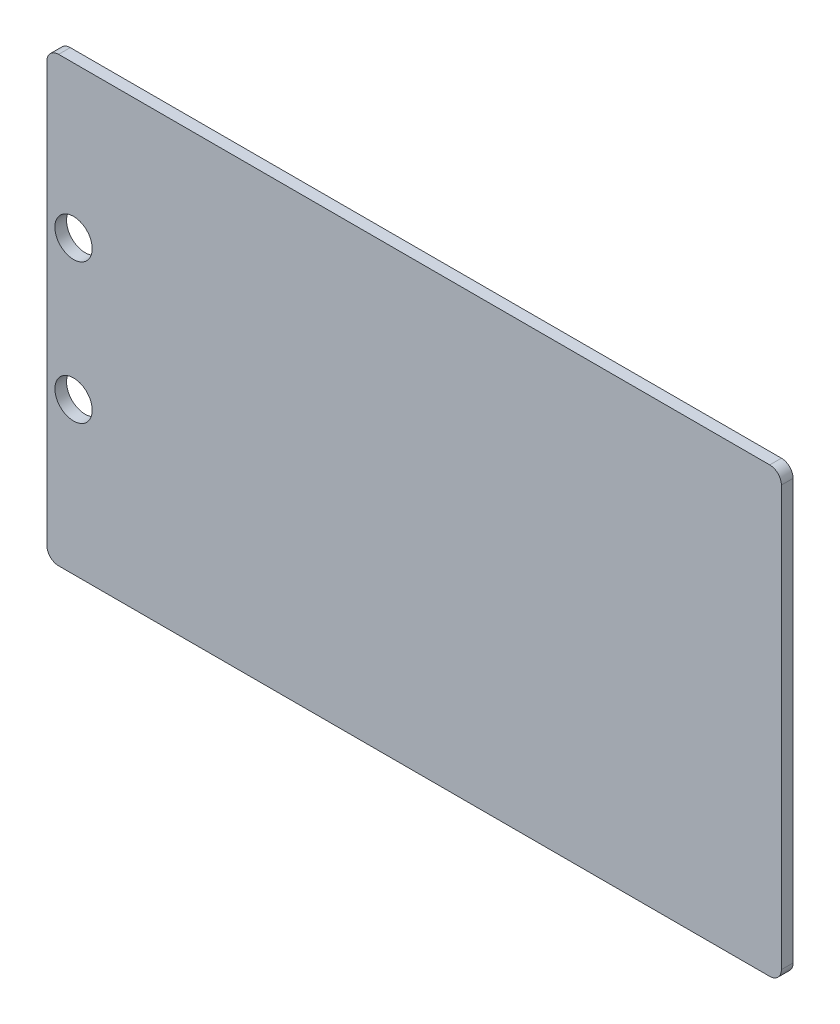
ISO-10303-21;
HEADER;
FILE_DESCRIPTION(('STEP AP214'),'2;1');
FILE_NAME('part.step','',(''),(''),'','','');
FILE_SCHEMA(('AUTOMOTIVE_DESIGN { 1 0 10303 214 1 1 1 1 }'));
ENDSEC;
DATA;
#1=APPLICATION_CONTEXT('core data for automotive mechanical design processes');
#2=APPLICATION_PROTOCOL_DEFINITION('international standard','automotive_design',2000,#1);
#3=PRODUCT_CONTEXT('',#1,'mechanical');
#4=PRODUCT('Part','Part','',(#3));
#5=PRODUCT_RELATED_PRODUCT_CATEGORY('part','',(#4));
#6=PRODUCT_DEFINITION_FORMATION('','',#4);
#7=PRODUCT_DEFINITION_CONTEXT('part definition',#1,'design');
#8=PRODUCT_DEFINITION('design','',#6,#7);
#9=PRODUCT_DEFINITION_SHAPE('','',#8);
#10=(LENGTH_UNIT() NAMED_UNIT(*) SI_UNIT(.MILLI.,.METRE.));
#11=(NAMED_UNIT(*) PLANE_ANGLE_UNIT() SI_UNIT($,.RADIAN.));
#12=(NAMED_UNIT(*) SI_UNIT($,.STERADIAN.) SOLID_ANGLE_UNIT());
#13=UNCERTAINTY_MEASURE_WITH_UNIT(LENGTH_MEASURE(1.E-05),#10,'distance_accuracy_value','');
#14=(GEOMETRIC_REPRESENTATION_CONTEXT(3) GLOBAL_UNCERTAINTY_ASSIGNED_CONTEXT((#13)) GLOBAL_UNIT_ASSIGNED_CONTEXT((#10,
#11,#12)) REPRESENTATION_CONTEXT('',''));
#15=CARTESIAN_POINT('',(0.,0.,0.));
#16=DIRECTION('',(0.,0.,1.));
#17=DIRECTION('',(1.,0.,0.));
#18=AXIS2_PLACEMENT_3D('',#15,#16,#17);
#19=CARTESIAN_POINT('',(31.5,19.,1.));
#20=DIRECTION('',(-1.,0.,0.));
#21=DIRECTION('',(0.,-1.,0.));
#22=AXIS2_PLACEMENT_3D('',#19,#20,#21);
#23=PLANE('',#22);
#24=DIRECTION('',(0.,1.,0.));
#25=VECTOR('',#24,1.);
#26=CARTESIAN_POINT('',(31.5,19.,0.));
#27=LINE('',#26,#25);
#28=CARTESIAN_POINT('',(31.5,-18.,0.));
#29=VERTEX_POINT('',#28);
#30=CARTESIAN_POINT('',(31.5,18.,0.));
#31=VERTEX_POINT('',#30);
#32=EDGE_CURVE('E131',#29,#31,#27,.T.);
#33=ORIENTED_EDGE('',*,*,#32,.T.);
#34=DIRECTION('',(0.,0.,-1.));
#35=VECTOR('',#34,1.);
#36=CARTESIAN_POINT('',(31.5,18.,1.));
#37=LINE('',#36,#35);
#38=CARTESIAN_POINT('',(31.5,18.,1.));
#39=VERTEX_POINT('',#38);
#40=EDGE_CURVE('E109',#31,#39,#37,.F.);
#41=ORIENTED_EDGE('',*,*,#40,.T.);
#42=DIRECTION('',(0.,1.,0.));
#43=VECTOR('',#42,1.);
#44=CARTESIAN_POINT('',(31.5,19.,1.));
#45=LINE('',#44,#43);
#46=CARTESIAN_POINT('',(31.5,-18.,1.));
#47=VERTEX_POINT('',#46);
#48=EDGE_CURVE('E140',#47,#39,#45,.T.);
#49=ORIENTED_EDGE('',*,*,#48,.F.);
#50=DIRECTION('',(0.,0.,-1.));
#51=VECTOR('',#50,1.);
#52=CARTESIAN_POINT('',(31.5,-18.,1.));
#53=LINE('',#52,#51);
#54=EDGE_CURVE('E114',#47,#29,#53,.T.);
#55=ORIENTED_EDGE('',*,*,#54,.T.);
#56=EDGE_LOOP('',(#33,#41,#49,#55));
#57=FACE_BOUND('',#56,.T.);
#58=ADVANCED_FACE('F36',(#57),#23,.F.);
#59=CARTESIAN_POINT('',(-31.5,19.,1.));
#60=DIRECTION('',(0.,-1.,0.));
#61=DIRECTION('',(0.,0.,-1.));
#62=AXIS2_PLACEMENT_3D('',#59,#60,#61);
#63=PLANE('',#62);
#64=DIRECTION('',(-1.,0.,0.));
#65=VECTOR('',#64,1.);
#66=CARTESIAN_POINT('',(-31.5,19.,1.));
#67=LINE('',#66,#65);
#68=CARTESIAN_POINT('',(30.5,19.,1.));
#69=VERTEX_POINT('',#68);
#70=CARTESIAN_POINT('',(-30.5,19.,1.));
#71=VERTEX_POINT('',#70);
#72=EDGE_CURVE('E124',#69,#71,#67,.T.);
#73=ORIENTED_EDGE('',*,*,#72,.F.);
#74=DIRECTION('',(0.,0.,-1.));
#75=VECTOR('',#74,1.);
#76=CARTESIAN_POINT('',(30.5,19.,1.));
#77=LINE('',#76,#75);
#78=CARTESIAN_POINT('',(30.5,19.,0.));
#79=VERTEX_POINT('',#78);
#80=EDGE_CURVE('E108',#69,#79,#77,.T.);
#81=ORIENTED_EDGE('',*,*,#80,.T.);
#82=DIRECTION('',(-1.,0.,0.));
#83=VECTOR('',#82,1.);
#84=CARTESIAN_POINT('',(-31.5,19.,0.));
#85=LINE('',#84,#83);
#86=CARTESIAN_POINT('',(-30.5,19.,0.));
#87=VERTEX_POINT('',#86);
#88=EDGE_CURVE('E121',#79,#87,#85,.T.);
#89=ORIENTED_EDGE('',*,*,#88,.T.);
#90=DIRECTION('',(0.,0.,-1.));
#91=VECTOR('',#90,1.);
#92=CARTESIAN_POINT('',(-30.5,19.,1.));
#93=LINE('',#92,#91);
#94=EDGE_CURVE('E126',#87,#71,#93,.F.);
#95=ORIENTED_EDGE('',*,*,#94,.T.);
#96=EDGE_LOOP('',(#73,#81,#89,#95));
#97=FACE_BOUND('',#96,.T.);
#98=ADVANCED_FACE('F120',(#97),#63,.F.);
#99=CARTESIAN_POINT('',(-31.5,19.,1.));
#100=DIRECTION('',(1.,0.,0.));
#101=DIRECTION('',(0.,1.,0.));
#102=AXIS2_PLACEMENT_3D('',#99,#100,#101);
#103=PLANE('',#102);
#104=DIRECTION('',(0.,-1.,0.));
#105=VECTOR('',#104,1.);
#106=CARTESIAN_POINT('',(-31.5,19.,0.));
#107=LINE('',#106,#105);
#108=CARTESIAN_POINT('',(-31.5,18.,0.));
#109=VERTEX_POINT('',#108);
#110=CARTESIAN_POINT('',(-31.5,-18.,0.));
#111=VERTEX_POINT('',#110);
#112=EDGE_CURVE('E130',#109,#111,#107,.T.);
#113=ORIENTED_EDGE('',*,*,#112,.T.);
#114=DIRECTION('',(0.,0.,-1.));
#115=VECTOR('',#114,1.);
#116=CARTESIAN_POINT('',(-31.5,-18.,1.));
#117=LINE('',#116,#115);
#118=CARTESIAN_POINT('',(-31.5,-18.,1.));
#119=VERTEX_POINT('',#118);
#120=EDGE_CURVE('E11',#111,#119,#117,.F.);
#121=ORIENTED_EDGE('',*,*,#120,.T.);
#122=DIRECTION('',(0.,-1.,0.));
#123=VECTOR('',#122,1.);
#124=CARTESIAN_POINT('',(-31.5,19.,1.));
#125=LINE('',#124,#123);
#126=CARTESIAN_POINT('',(-31.5,18.,1.));
#127=VERTEX_POINT('',#126);
#128=EDGE_CURVE('E179',#127,#119,#125,.T.);
#129=ORIENTED_EDGE('',*,*,#128,.F.);
#130=DIRECTION('',(0.,0.,-1.));
#131=VECTOR('',#130,1.);
#132=CARTESIAN_POINT('',(-31.5,18.,1.));
#133=LINE('',#132,#131);
#134=EDGE_CURVE('E45',#127,#109,#133,.T.);
#135=ORIENTED_EDGE('',*,*,#134,.T.);
#136=EDGE_LOOP('',(#113,#121,#129,#135));
#137=FACE_BOUND('',#136,.T.);
#138=ADVANCED_FACE('F194',(#137),#103,.F.);
#139=CARTESIAN_POINT('',(-31.5,-19.,1.));
#140=DIRECTION('',(0.,1.,0.));
#141=DIRECTION('',(0.,0.,1.));
#142=AXIS2_PLACEMENT_3D('',#139,#140,#141);
#143=PLANE('',#142);
#144=DIRECTION('',(1.,0.,0.));
#145=VECTOR('',#144,1.);
#146=CARTESIAN_POINT('',(-31.5,-19.,0.));
#147=LINE('',#146,#145);
#148=CARTESIAN_POINT('',(-30.5,-19.,0.));
#149=VERTEX_POINT('',#148);
#150=CARTESIAN_POINT('',(30.5,-19.,0.));
#151=VERTEX_POINT('',#150);
#152=EDGE_CURVE('E134',#149,#151,#147,.T.);
#153=ORIENTED_EDGE('',*,*,#152,.T.);
#154=DIRECTION('',(0.,0.,-1.));
#155=VECTOR('',#154,1.);
#156=CARTESIAN_POINT('',(30.5,-19.,1.));
#157=LINE('',#156,#155);
#158=CARTESIAN_POINT('',(30.5,-19.,1.));
#159=VERTEX_POINT('',#158);
#160=EDGE_CURVE('E53',#151,#159,#157,.F.);
#161=ORIENTED_EDGE('',*,*,#160,.T.);
#162=DIRECTION('',(1.,0.,0.));
#163=VECTOR('',#162,1.);
#164=CARTESIAN_POINT('',(-31.5,-19.,1.));
#165=LINE('',#164,#163);
#166=CARTESIAN_POINT('',(-30.5,-19.,1.));
#167=VERTEX_POINT('',#166);
#168=EDGE_CURVE('E141',#167,#159,#165,.T.);
#169=ORIENTED_EDGE('',*,*,#168,.F.);
#170=DIRECTION('',(0.,0.,-1.));
#171=VECTOR('',#170,1.);
#172=CARTESIAN_POINT('',(-30.5,-19.,1.));
#173=LINE('',#172,#171);
#174=EDGE_CURVE('E157',#167,#149,#173,.T.);
#175=ORIENTED_EDGE('',*,*,#174,.T.);
#176=EDGE_LOOP('',(#153,#161,#169,#175));
#177=FACE_BOUND('',#176,.T.);
#178=ADVANCED_FACE('F189',(#177),#143,.F.);
#179=CARTESIAN_POINT('',(0.,0.,1.));
#180=DIRECTION('',(0.,0.,1.));
#181=DIRECTION('',(1.,0.,0.));
#182=AXIS2_PLACEMENT_3D('',#179,#180,#181);
#183=PLANE('',#182);
#184=CARTESIAN_POINT('',(-29.2188746750091,-6.00000000000001,1.));
#185=DIRECTION('',(0.,0.,1.));
#186=DIRECTION('',(1.,0.,0.));
#187=AXIS2_PLACEMENT_3D('',#184,#185,#186);
#188=CIRCLE('',#187,1.6);
#189=CARTESIAN_POINT('',(-27.6188746750091,-6.00000000000001,1.));
#190=VERTEX_POINT('',#189);
#191=EDGE_CURVE('E164',#190,#190,#188,.T.);
#192=ORIENTED_EDGE('',*,*,#191,.F.);
#193=EDGE_LOOP('',(#192));
#194=FACE_BOUND('',#193,.T.);
#195=CARTESIAN_POINT('',(-29.2188746750091,5.99999999999999,1.));
#196=DIRECTION('',(0.,0.,1.));
#197=DIRECTION('',(1.,0.,0.));
#198=AXIS2_PLACEMENT_3D('',#195,#196,#197);
#199=CIRCLE('',#198,1.6);
#200=CARTESIAN_POINT('',(-27.6188746750091,5.99999999999999,1.));
#201=VERTEX_POINT('',#200);
#202=EDGE_CURVE('E169',#201,#201,#199,.T.);
#203=ORIENTED_EDGE('',*,*,#202,.F.);
#204=EDGE_LOOP('',(#203));
#205=FACE_BOUND('',#204,.T.);
#206=ORIENTED_EDGE('',*,*,#48,.T.);
#207=CARTESIAN_POINT('',(30.5,18.,1.));
#208=DIRECTION('',(0.,0.,1.));
#209=DIRECTION('',(1.,0.,0.));
#210=AXIS2_PLACEMENT_3D('',#207,#208,#209);
#211=CIRCLE('',#210,1.);
#212=EDGE_CURVE('E155',#39,#69,#211,.T.);
#213=ORIENTED_EDGE('',*,*,#212,.T.);
#214=ORIENTED_EDGE('',*,*,#72,.T.);
#215=CARTESIAN_POINT('',(-30.5,18.,1.));
#216=DIRECTION('',(0.,0.,1.));
#217=DIRECTION('',(1.,0.,0.));
#218=AXIS2_PLACEMENT_3D('',#215,#216,#217);
#219=CIRCLE('',#218,1.);
#220=EDGE_CURVE('E150',#71,#127,#219,.T.);
#221=ORIENTED_EDGE('',*,*,#220,.T.);
#222=ORIENTED_EDGE('',*,*,#128,.T.);
#223=CARTESIAN_POINT('',(-30.5,-18.,1.));
#224=DIRECTION('',(0.,0.,1.));
#225=DIRECTION('',(1.,0.,0.));
#226=AXIS2_PLACEMENT_3D('',#223,#224,#225);
#227=CIRCLE('',#226,1.);
#228=EDGE_CURVE('E60',#119,#167,#227,.T.);
#229=ORIENTED_EDGE('',*,*,#228,.T.);
#230=ORIENTED_EDGE('',*,*,#168,.T.);
#231=CARTESIAN_POINT('',(30.5,-18.,1.));
#232=DIRECTION('',(0.,0.,1.));
#233=DIRECTION('',(1.,0.,0.));
#234=AXIS2_PLACEMENT_3D('',#231,#232,#233);
#235=CIRCLE('',#234,1.);
#236=EDGE_CURVE('E153',#159,#47,#235,.T.);
#237=ORIENTED_EDGE('',*,*,#236,.T.);
#238=EDGE_LOOP('',(#206,#213,#214,#221,#222,#229,#230,#237));
#239=FACE_BOUND('',#238,.T.);
#240=ADVANCED_FACE('F181',(#194,#205,#239),#183,.T.);
#241=CARTESIAN_POINT('',(0.,0.,0.));
#242=DIRECTION('',(0.,0.,1.));
#243=DIRECTION('',(1.,0.,0.));
#244=AXIS2_PLACEMENT_3D('',#241,#242,#243);
#245=PLANE('',#244);
#246=CARTESIAN_POINT('',(-29.2188746750091,-6.00000000000001,0.));
#247=DIRECTION('',(0.,0.,1.));
#248=DIRECTION('',(1.,0.,0.));
#249=AXIS2_PLACEMENT_3D('',#246,#247,#248);
#250=CIRCLE('',#249,1.6);
#251=CARTESIAN_POINT('',(-27.6188746750091,-6.00000000000001,0.));
#252=VERTEX_POINT('',#251);
#253=EDGE_CURVE('E40',#252,#252,#250,.T.);
#254=ORIENTED_EDGE('',*,*,#253,.T.);
#255=EDGE_LOOP('',(#254));
#256=FACE_BOUND('',#255,.T.);
#257=CARTESIAN_POINT('',(-29.2188746750091,5.99999999999999,0.));
#258=DIRECTION('',(0.,0.,1.));
#259=DIRECTION('',(1.,0.,0.));
#260=AXIS2_PLACEMENT_3D('',#257,#258,#259);
#261=CIRCLE('',#260,1.6);
#262=CARTESIAN_POINT('',(-27.6188746750091,5.99999999999999,0.));
#263=VERTEX_POINT('',#262);
#264=EDGE_CURVE('E162',#263,#263,#261,.T.);
#265=ORIENTED_EDGE('',*,*,#264,.T.);
#266=EDGE_LOOP('',(#265));
#267=FACE_BOUND('',#266,.T.);
#268=ORIENTED_EDGE('',*,*,#88,.F.);
#269=CARTESIAN_POINT('',(30.5,18.,0.));
#270=DIRECTION('',(0.,0.,1.));
#271=DIRECTION('',(1.,0.,0.));
#272=AXIS2_PLACEMENT_3D('',#269,#270,#271);
#273=CIRCLE('',#272,1.);
#274=EDGE_CURVE('E104',#79,#31,#273,.F.);
#275=ORIENTED_EDGE('',*,*,#274,.T.);
#276=ORIENTED_EDGE('',*,*,#32,.F.);
#277=CARTESIAN_POINT('',(30.5,-18.,0.));
#278=DIRECTION('',(0.,0.,1.));
#279=DIRECTION('',(1.,0.,0.));
#280=AXIS2_PLACEMENT_3D('',#277,#278,#279);
#281=CIRCLE('',#280,1.);
#282=EDGE_CURVE('E115',#29,#151,#281,.F.);
#283=ORIENTED_EDGE('',*,*,#282,.T.);
#284=ORIENTED_EDGE('',*,*,#152,.F.);
#285=CARTESIAN_POINT('',(-30.5,-18.,0.));
#286=DIRECTION('',(0.,0.,1.));
#287=DIRECTION('',(1.,0.,0.));
#288=AXIS2_PLACEMENT_3D('',#285,#286,#287);
#289=CIRCLE('',#288,1.);
#290=EDGE_CURVE('E144',#149,#111,#289,.F.);
#291=ORIENTED_EDGE('',*,*,#290,.T.);
#292=ORIENTED_EDGE('',*,*,#112,.F.);
#293=CARTESIAN_POINT('',(-30.5,18.,0.));
#294=DIRECTION('',(0.,0.,1.));
#295=DIRECTION('',(1.,0.,0.));
#296=AXIS2_PLACEMENT_3D('',#293,#294,#295);
#297=CIRCLE('',#296,1.);
#298=EDGE_CURVE('E125',#109,#87,#297,.F.);
#299=ORIENTED_EDGE('',*,*,#298,.T.);
#300=EDGE_LOOP('',(#268,#275,#276,#283,#284,#291,#292,#299));
#301=FACE_BOUND('',#300,.T.);
#302=ADVANCED_FACE('F128',(#256,#267,#301),#245,.F.);
#303=CARTESIAN_POINT('',(30.5,18.,1.));
#304=DIRECTION('',(0.,0.,-1.));
#305=DIRECTION('',(-1.,0.,0.));
#306=AXIS2_PLACEMENT_3D('',#303,#304,#305);
#307=CYLINDRICAL_SURFACE('',#306,1.);
#308=ORIENTED_EDGE('',*,*,#212,.F.);
#309=ORIENTED_EDGE('',*,*,#40,.F.);
#310=ORIENTED_EDGE('',*,*,#274,.F.);
#311=ORIENTED_EDGE('',*,*,#80,.F.);
#312=EDGE_LOOP('',(#308,#309,#310,#311));
#313=FACE_BOUND('',#312,.T.);
#314=ADVANCED_FACE('F107',(#313),#307,.T.);
#315=CARTESIAN_POINT('',(30.5,-18.,1.));
#316=DIRECTION('',(0.,0.,-1.));
#317=DIRECTION('',(-1.,0.,0.));
#318=AXIS2_PLACEMENT_3D('',#315,#316,#317);
#319=CYLINDRICAL_SURFACE('',#318,1.);
#320=ORIENTED_EDGE('',*,*,#236,.F.);
#321=ORIENTED_EDGE('',*,*,#160,.F.);
#322=ORIENTED_EDGE('',*,*,#282,.F.);
#323=ORIENTED_EDGE('',*,*,#54,.F.);
#324=EDGE_LOOP('',(#320,#321,#322,#323));
#325=FACE_BOUND('',#324,.T.);
#326=ADVANCED_FACE('F186',(#325),#319,.T.);
#327=CARTESIAN_POINT('',(-30.5,-18.,1.));
#328=DIRECTION('',(0.,0.,-1.));
#329=DIRECTION('',(-1.,0.,0.));
#330=AXIS2_PLACEMENT_3D('',#327,#328,#329);
#331=CYLINDRICAL_SURFACE('',#330,1.);
#332=ORIENTED_EDGE('',*,*,#228,.F.);
#333=ORIENTED_EDGE('',*,*,#120,.F.);
#334=ORIENTED_EDGE('',*,*,#290,.F.);
#335=ORIENTED_EDGE('',*,*,#174,.F.);
#336=EDGE_LOOP('',(#332,#333,#334,#335));
#337=FACE_BOUND('',#336,.T.);
#338=ADVANCED_FACE('F191',(#337),#331,.T.);
#339=CARTESIAN_POINT('',(-30.5,18.,1.));
#340=DIRECTION('',(0.,0.,-1.));
#341=DIRECTION('',(-1.,0.,0.));
#342=AXIS2_PLACEMENT_3D('',#339,#340,#341);
#343=CYLINDRICAL_SURFACE('',#342,1.);
#344=ORIENTED_EDGE('',*,*,#220,.F.);
#345=ORIENTED_EDGE('',*,*,#94,.F.);
#346=ORIENTED_EDGE('',*,*,#298,.F.);
#347=ORIENTED_EDGE('',*,*,#134,.F.);
#348=EDGE_LOOP('',(#344,#345,#346,#347));
#349=FACE_BOUND('',#348,.T.);
#350=ADVANCED_FACE('F38',(#349),#343,.T.);
#351=CARTESIAN_POINT('',(-29.2188746750091,5.99999999999999,-1.));
#352=DIRECTION('',(0.,0.,1.));
#353=DIRECTION('',(1.,0.,0.));
#354=AXIS2_PLACEMENT_3D('',#351,#352,#353);
#355=CYLINDRICAL_SURFACE('',#354,1.6);
#356=ORIENTED_EDGE('',*,*,#202,.T.);
#357=EDGE_LOOP('',(#356));
#358=FACE_BOUND('',#357,.T.);
#359=ORIENTED_EDGE('',*,*,#264,.F.);
#360=EDGE_LOOP('',(#359));
#361=FACE_BOUND('',#360,.T.);
#362=ADVANCED_FACE('F200',(#358,#361),#355,.F.);
#363=CARTESIAN_POINT('',(-29.2188746750091,-6.00000000000001,-1.));
#364=DIRECTION('',(0.,0.,1.));
#365=DIRECTION('',(1.,0.,0.));
#366=AXIS2_PLACEMENT_3D('',#363,#364,#365);
#367=CYLINDRICAL_SURFACE('',#366,1.6);
#368=ORIENTED_EDGE('',*,*,#191,.T.);
#369=EDGE_LOOP('',(#368));
#370=FACE_BOUND('',#369,.T.);
#371=ORIENTED_EDGE('',*,*,#253,.F.);
#372=EDGE_LOOP('',(#371));
#373=FACE_BOUND('',#372,.T.);
#374=ADVANCED_FACE('F205',(#370,#373),#367,.F.);
#375=CLOSED_SHELL('',(#58,#98,#138,#178,#240,#302,#314,#326,#338,#350,#362,#374));
#376=MANIFOLD_SOLID_BREP('B2',#375);
#377=ADVANCED_BREP_SHAPE_REPRESENTATION('',(#18,#376),#14);
#378=SHAPE_DEFINITION_REPRESENTATION(#9,#377);
ENDSEC;
END-ISO-10303-21;
